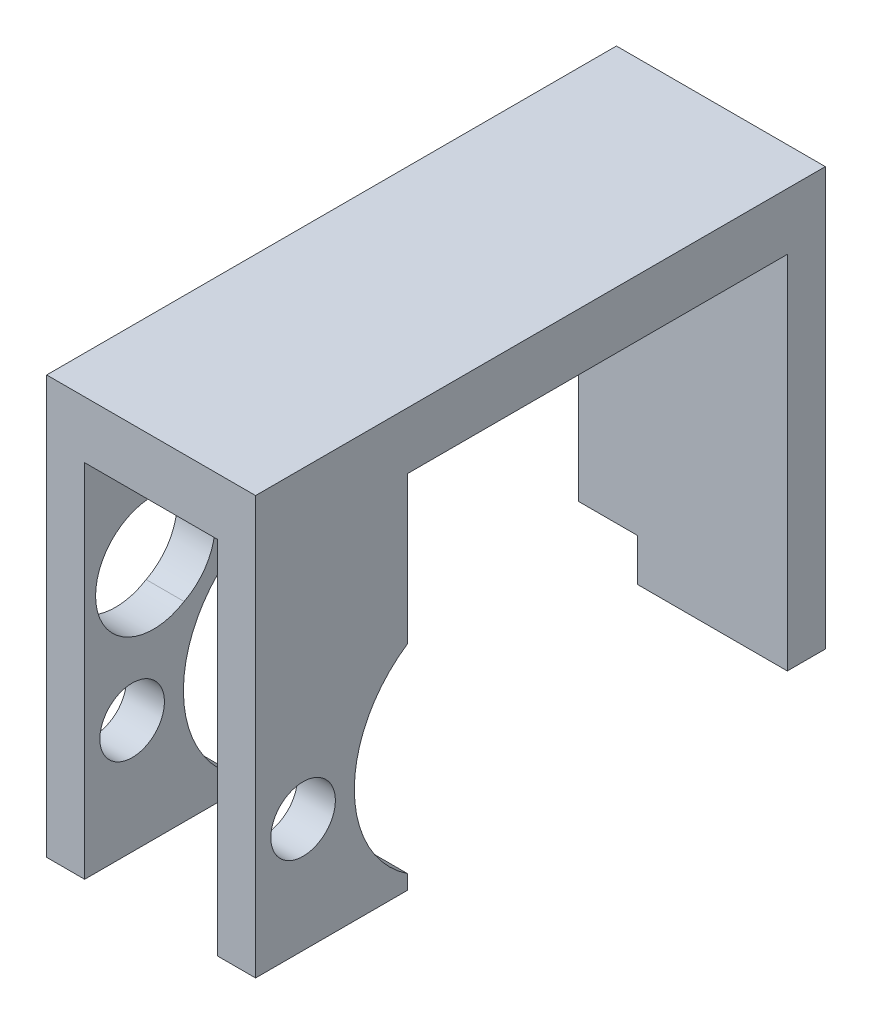
ISO-10303-21;
HEADER;
FILE_DESCRIPTION(('STEP AP214'),'2;1');
FILE_NAME('part.step','',(''),(''),'','','');
FILE_SCHEMA(('AUTOMOTIVE_DESIGN { 1 0 10303 214 1 1 1 1 }'));
ENDSEC;
DATA;
#1=APPLICATION_CONTEXT('core data for automotive mechanical design processes');
#2=APPLICATION_PROTOCOL_DEFINITION('international standard','automotive_design',2000,#1);
#3=PRODUCT_CONTEXT('',#1,'mechanical');
#4=PRODUCT('Part','Part','',(#3));
#5=PRODUCT_RELATED_PRODUCT_CATEGORY('part','',(#4));
#6=PRODUCT_DEFINITION_FORMATION('','',#4);
#7=PRODUCT_DEFINITION_CONTEXT('part definition',#1,'design');
#8=PRODUCT_DEFINITION('design','',#6,#7);
#9=PRODUCT_DEFINITION_SHAPE('','',#8);
#10=(LENGTH_UNIT() NAMED_UNIT(*) SI_UNIT(.MILLI.,.METRE.));
#11=(NAMED_UNIT(*) PLANE_ANGLE_UNIT() SI_UNIT($,.RADIAN.));
#12=(NAMED_UNIT(*) SI_UNIT($,.STERADIAN.) SOLID_ANGLE_UNIT());
#13=UNCERTAINTY_MEASURE_WITH_UNIT(LENGTH_MEASURE(1.E-05),#10,'distance_accuracy_value','');
#14=(GEOMETRIC_REPRESENTATION_CONTEXT(3) GLOBAL_UNCERTAINTY_ASSIGNED_CONTEXT((#13)) GLOBAL_UNIT_ASSIGNED_CONTEXT((#10,
#11,#12)) REPRESENTATION_CONTEXT('',''));
#15=CARTESIAN_POINT('',(0.,0.,0.));
#16=DIRECTION('',(0.,0.,1.));
#17=DIRECTION('',(1.,0.,0.));
#18=AXIS2_PLACEMENT_3D('',#15,#16,#17);
#19=CARTESIAN_POINT('',(-8.9,35.7198777887695,-11.8675));
#20=DIRECTION('',(-1.,0.,0.));
#21=DIRECTION('',(0.,0.,1.));
#22=AXIS2_PLACEMENT_3D('',#19,#20,#21);
#23=CYLINDRICAL_SURFACE('',#22,3.);
#24=CARTESIAN_POINT('',(-10.,35.7198777887695,-11.8675));
#25=DIRECTION('',(1.,0.,0.));
#26=DIRECTION('',(0.,0.,1.));
#27=AXIS2_PLACEMENT_3D('',#24,#25,#26);
#28=CIRCLE('',#27,3.);
#29=CARTESIAN_POINT('',(-10.,38.6800828893261,-11.3804827902028));
#30=VERTEX_POINT('',#29);
#31=CARTESIAN_POINT('',(-10.,33.0507418472652,-13.2370668387377));
#32=VERTEX_POINT('',#31);
#33=EDGE_CURVE('E193',#30,#32,#28,.F.);
#34=ORIENTED_EDGE('',*,*,#33,.F.);
#35=DIRECTION('',(-1.,0.,0.));
#36=VECTOR('',#35,1.);
#37=CARTESIAN_POINT('',(-10.5,38.6800828893261,-11.3804827902028));
#38=LINE('',#37,#36);
#39=CARTESIAN_POINT('',(-12.,38.6800828893261,-11.3804827902028));
#40=VERTEX_POINT('',#39);
#41=EDGE_CURVE('E47',#40,#30,#38,.F.);
#42=ORIENTED_EDGE('',*,*,#41,.F.);
#43=CARTESIAN_POINT('',(-12.,35.7198777887695,-11.8675));
#44=DIRECTION('',(-1.,0.,0.));
#45=DIRECTION('',(0.,0.,-1.));
#46=AXIS2_PLACEMENT_3D('',#43,#44,#45);
#47=CIRCLE('',#46,3.);
#48=CARTESIAN_POINT('',(-12.,33.0507418472652,-13.2370668387377));
#49=VERTEX_POINT('',#48);
#50=EDGE_CURVE('E191',#49,#40,#47,.F.);
#51=ORIENTED_EDGE('',*,*,#50,.F.);
#52=DIRECTION('',(-1.,0.,0.));
#53=VECTOR('',#52,1.);
#54=CARTESIAN_POINT('',(-10.5,33.0507418472652,-13.2370668387377));
#55=LINE('',#54,#53);
#56=EDGE_CURVE('E11',#32,#49,#55,.T.);
#57=ORIENTED_EDGE('',*,*,#56,.F.);
#58=EDGE_LOOP('',(#34,#42,#51,#57));
#59=FACE_BOUND('',#58,.T.);
#60=ADVANCED_FACE('F41',(#59),#23,.F.);
#61=CARTESIAN_POINT('',(0.,0.,-38.));
#62=DIRECTION('',(0.,0.,1.));
#63=DIRECTION('',(1.,0.,0.));
#64=AXIS2_PLACEMENT_3D('',#61,#62,#63);
#65=PLANE('',#64);
#66=DIRECTION('',(-1.,0.,0.));
#67=VECTOR('',#66,1.);
#68=CARTESIAN_POINT('',(-8.9,23.3190905958273,-38.));
#69=LINE('',#68,#67);
#70=CARTESIAN_POINT('',(-8.9,23.3190905958273,-38.));
#71=VERTEX_POINT('',#70);
#72=CARTESIAN_POINT('',(-12.,23.3190905958273,-38.));
#73=VERTEX_POINT('',#72);
#74=EDGE_CURVE('E343',#71,#73,#69,.T.);
#75=ORIENTED_EDGE('',*,*,#74,.T.);
#76=DIRECTION('',(0.,1.,0.));
#77=VECTOR('',#76,1.);
#78=CARTESIAN_POINT('',(-12.,42.,-38.));
#79=LINE('',#78,#77);
#80=CARTESIAN_POINT('',(-12.,45.,-38.));
#81=VERTEX_POINT('',#80);
#82=EDGE_CURVE('E269',#73,#81,#79,.T.);
#83=ORIENTED_EDGE('',*,*,#82,.T.);
#84=DIRECTION('',(1.,0.,0.));
#85=VECTOR('',#84,1.);
#86=CARTESIAN_POINT('',(-12.,45.,-38.));
#87=LINE('',#86,#85);
#88=CARTESIAN_POINT('',(-1.,45.,-38.));
#89=VERTEX_POINT('',#88);
#90=EDGE_CURVE('E267',#81,#89,#87,.T.);
#91=ORIENTED_EDGE('',*,*,#90,.T.);
#92=DIRECTION('',(0.,-1.,0.));
#93=VECTOR('',#92,1.);
#94=CARTESIAN_POINT('',(-1.,45.,-38.));
#95=LINE('',#94,#93);
#96=CARTESIAN_POINT('',(-1.,23.,-38.));
#97=VERTEX_POINT('',#96);
#98=EDGE_CURVE('E265',#89,#97,#95,.T.);
#99=ORIENTED_EDGE('',*,*,#98,.T.);
#100=DIRECTION('',(-1.,0.,0.));
#101=VECTOR('',#100,1.);
#102=CARTESIAN_POINT('',(-1.,23.,-38.));
#103=LINE('',#102,#101);
#104=CARTESIAN_POINT('',(-8.9,23.,-38.));
#105=VERTEX_POINT('',#104);
#106=EDGE_CURVE('E305',#97,#105,#103,.T.);
#107=ORIENTED_EDGE('',*,*,#106,.T.);
#108=DIRECTION('',(0.,-1.,0.));
#109=VECTOR('',#108,1.);
#110=CARTESIAN_POINT('',(-8.9,0.,-38.));
#111=LINE('',#110,#109);
#112=EDGE_CURVE('E192',#71,#105,#111,.T.);
#113=ORIENTED_EDGE('',*,*,#112,.F.);
#114=EDGE_LOOP('',(#75,#83,#91,#99,#107,#113));
#115=FACE_BOUND('',#114,.T.);
#116=ADVANCED_FACE('F359',(#115),#65,.F.);
#117=CARTESIAN_POINT('',(-8.9,22.5,-34.765));
#118=DIRECTION('',(-1.,0.,0.));
#119=DIRECTION('',(0.,0.,1.));
#120=AXIS2_PLACEMENT_3D('',#117,#118,#119);
#121=CYLINDRICAL_SURFACE('',#120,3.);
#122=CARTESIAN_POINT('',(-8.9,22.5,-34.765));
#123=DIRECTION('',(-1.,0.,0.));
#124=DIRECTION('',(0.,0.,-1.));
#125=AXIS2_PLACEMENT_3D('',#122,#123,#124);
#126=CIRCLE('',#125,3.);
#127=CARTESIAN_POINT('',(-8.9,25.23400347476,-36.));
#128=VERTEX_POINT('',#127);
#129=CARTESIAN_POINT('',(-8.9,24.4926321294143,-37.007636215891));
#130=VERTEX_POINT('',#129);
#131=EDGE_CURVE('E336',#128,#130,#126,.T.);
#132=ORIENTED_EDGE('',*,*,#131,.F.);
#133=DIRECTION('',(-1.,0.,0.));
#134=VECTOR('',#133,1.);
#135=CARTESIAN_POINT('',(-8.9,25.23400347476,-36.));
#136=LINE('',#135,#134);
#137=CARTESIAN_POINT('',(-12.,25.23400347476,-36.));
#138=VERTEX_POINT('',#137);
#139=EDGE_CURVE('E201',#128,#138,#136,.T.);
#140=ORIENTED_EDGE('',*,*,#139,.T.);
#141=CARTESIAN_POINT('',(-12.,22.5,-34.765));
#142=DIRECTION('',(-1.,0.,0.));
#143=DIRECTION('',(0.,0.,-1.));
#144=AXIS2_PLACEMENT_3D('',#141,#142,#143);
#145=CIRCLE('',#144,3.);
#146=CARTESIAN_POINT('',(-12.,24.4926321294143,-37.007636215891));
#147=VERTEX_POINT('',#146);
#148=EDGE_CURVE('E333',#147,#138,#145,.F.);
#149=ORIENTED_EDGE('',*,*,#148,.F.);
#150=DIRECTION('',(-1.,0.,0.));
#151=VECTOR('',#150,1.);
#152=CARTESIAN_POINT('',(-10.5,24.4926321294143,-37.007636215891));
#153=LINE('',#152,#151);
#154=EDGE_CURVE('E349',#130,#147,#153,.T.);
#155=ORIENTED_EDGE('',*,*,#154,.F.);
#156=EDGE_LOOP('',(#132,#140,#149,#155));
#157=FACE_BOUND('',#156,.T.);
#158=ADVANCED_FACE('F382',(#157),#121,.F.);
#159=CARTESIAN_POINT('',(0.,0.,-36.));
#160=DIRECTION('',(0.,0.,1.));
#161=DIRECTION('',(1.,0.,0.));
#162=AXIS2_PLACEMENT_3D('',#159,#160,#161);
#163=PLANE('',#162);
#164=DIRECTION('',(0.,-1.,0.));
#165=VECTOR('',#164,1.);
#166=CARTESIAN_POINT('',(-8.9,0.,-36.));
#167=LINE('',#166,#165);
#168=CARTESIAN_POINT('',(-8.9,23.,-36.));
#169=VERTEX_POINT('',#168);
#170=EDGE_CURVE('E331',#128,#169,#167,.T.);
#171=ORIENTED_EDGE('',*,*,#170,.T.);
#172=DIRECTION('',(-1.,0.,0.));
#173=VECTOR('',#172,1.);
#174=CARTESIAN_POINT('',(-1.,23.,-36.));
#175=LINE('',#174,#173);
#176=CARTESIAN_POINT('',(-1.,23.,-36.));
#177=VERTEX_POINT('',#176);
#178=EDGE_CURVE('E301',#177,#169,#175,.T.);
#179=ORIENTED_EDGE('',*,*,#178,.F.);
#180=DIRECTION('',(0.,-1.,0.));
#181=VECTOR('',#180,1.);
#182=CARTESIAN_POINT('',(-1.,45.,-36.));
#183=LINE('',#182,#181);
#184=CARTESIAN_POINT('',(-1.,42.,-36.));
#185=VERTEX_POINT('',#184);
#186=EDGE_CURVE('E307',#185,#177,#183,.T.);
#187=ORIENTED_EDGE('',*,*,#186,.F.);
#188=DIRECTION('',(-1.,0.,0.));
#189=VECTOR('',#188,1.);
#190=CARTESIAN_POINT('',(-1.,42.,-36.));
#191=LINE('',#190,#189);
#192=CARTESIAN_POINT('',(-12.,42.,-36.));
#193=VERTEX_POINT('',#192);
#194=EDGE_CURVE('E298',#185,#193,#191,.T.);
#195=ORIENTED_EDGE('',*,*,#194,.T.);
#196=DIRECTION('',(0.,1.,0.));
#197=VECTOR('',#196,1.);
#198=CARTESIAN_POINT('',(-12.,23.,-36.));
#199=LINE('',#198,#197);
#200=EDGE_CURVE('E304',#138,#193,#199,.T.);
#201=ORIENTED_EDGE('',*,*,#200,.F.);
#202=ORIENTED_EDGE('',*,*,#139,.F.);
#203=EDGE_LOOP('',(#171,#179,#187,#195,#201,#202));
#204=FACE_BOUND('',#203,.T.);
#205=ADVANCED_FACE('F378',(#204),#163,.T.);
#206=CARTESIAN_POINT('',(-1.,23.,-36.));
#207=DIRECTION('',(0.,1.,0.));
#208=DIRECTION('',(0.,0.,-1.));
#209=AXIS2_PLACEMENT_3D('',#206,#207,#208);
#210=PLANE('',#209);
#211=ORIENTED_EDGE('',*,*,#106,.F.);
#212=DIRECTION('',(0.,0.,-1.));
#213=VECTOR('',#212,1.);
#214=CARTESIAN_POINT('',(-1.,23.,-36.));
#215=LINE('',#214,#213);
#216=EDGE_CURVE('E299',#177,#97,#215,.T.);
#217=ORIENTED_EDGE('',*,*,#216,.F.);
#218=ORIENTED_EDGE('',*,*,#178,.T.);
#219=DIRECTION('',(0.,0.,1.));
#220=VECTOR('',#219,1.);
#221=CARTESIAN_POINT('',(-8.9,23.,-36.));
#222=LINE('',#221,#220);
#223=EDGE_CURVE('E200',#105,#169,#222,.T.);
#224=ORIENTED_EDGE('',*,*,#223,.F.);
#225=EDGE_LOOP('',(#211,#217,#218,#224));
#226=FACE_BOUND('',#225,.T.);
#227=ADVANCED_FACE('F376',(#226),#210,.F.);
#228=CARTESIAN_POINT('',(0.,0.,-16.));
#229=DIRECTION('',(0.,0.,1.));
#230=DIRECTION('',(1.,0.,0.));
#231=AXIS2_PLACEMENT_3D('',#228,#229,#230);
#232=PLANE('',#231);
#233=DIRECTION('',(-1.,0.,0.));
#234=VECTOR('',#233,1.);
#235=CARTESIAN_POINT('',(-0.799999999999999,23.7616796585165,-16.));
#236=LINE('',#235,#234);
#237=CARTESIAN_POINT('',(-12.,23.7616796585165,-16.));
#238=VERTEX_POINT('',#237);
#239=CARTESIAN_POINT('',(-10.,23.7616796585165,-16.));
#240=VERTEX_POINT('',#239);
#241=EDGE_CURVE('E314',#238,#240,#236,.F.);
#242=ORIENTED_EDGE('',*,*,#241,.T.);
#243=DIRECTION('',(0.,-1.,0.));
#244=VECTOR('',#243,1.);
#245=CARTESIAN_POINT('',(-10.,45.,-16.));
#246=LINE('',#245,#244);
#247=CARTESIAN_POINT('',(-10.,23.,-16.));
#248=VERTEX_POINT('',#247);
#249=EDGE_CURVE('E238',#240,#248,#246,.T.);
#250=ORIENTED_EDGE('',*,*,#249,.T.);
#251=DIRECTION('',(-1.,0.,0.));
#252=VECTOR('',#251,1.);
#253=CARTESIAN_POINT('',(-10.,23.,-16.));
#254=LINE('',#253,#252);
#255=CARTESIAN_POINT('',(-12.,23.,-16.));
#256=VERTEX_POINT('',#255);
#257=EDGE_CURVE('E233',#248,#256,#254,.T.);
#258=ORIENTED_EDGE('',*,*,#257,.T.);
#259=DIRECTION('',(0.,1.,0.));
#260=VECTOR('',#259,1.);
#261=CARTESIAN_POINT('',(-12.,23.,-16.));
#262=LINE('',#261,#260);
#263=EDGE_CURVE('E237',#256,#238,#262,.T.);
#264=ORIENTED_EDGE('',*,*,#263,.T.);
#265=EDGE_LOOP('',(#242,#250,#258,#264));
#266=FACE_BOUND('',#265,.T.);
#267=ADVANCED_FACE('F398',(#266),#232,.F.);
#268=DIRECTION('',(-1.,0.,0.));
#269=VECTOR('',#268,1.);
#270=CARTESIAN_POINT('',(-0.799999999999999,34.2383203414835,-16.));
#271=LINE('',#270,#269);
#272=CARTESIAN_POINT('',(-10.,34.2383203414835,-16.));
#273=VERTEX_POINT('',#272);
#274=CARTESIAN_POINT('',(-12.,34.2383203414835,-16.));
#275=VERTEX_POINT('',#274);
#276=EDGE_CURVE('E319',#273,#275,#271,.T.);
#277=ORIENTED_EDGE('',*,*,#276,.T.);
#278=CARTESIAN_POINT('',(-12.,42.,-16.));
#279=VERTEX_POINT('',#278);
#280=EDGE_CURVE('E245',#275,#279,#262,.T.);
#281=ORIENTED_EDGE('',*,*,#280,.T.);
#282=DIRECTION('',(1.,0.,0.));
#283=VECTOR('',#282,1.);
#284=CARTESIAN_POINT('',(0.,42.,-16.));
#285=LINE('',#284,#283);
#286=CARTESIAN_POINT('',(-10.,42.,-16.));
#287=VERTEX_POINT('',#286);
#288=EDGE_CURVE('E222',#279,#287,#285,.T.);
#289=ORIENTED_EDGE('',*,*,#288,.T.);
#290=EDGE_CURVE('E232',#287,#273,#246,.T.);
#291=ORIENTED_EDGE('',*,*,#290,.T.);
#292=EDGE_LOOP('',(#277,#281,#289,#291));
#293=FACE_BOUND('',#292,.T.);
#294=ADVANCED_FACE('F392',(#293),#232,.F.);
#295=CARTESIAN_POINT('',(0.,0.,-16.));
#296=DIRECTION('',(0.,0.,1.));
#297=DIRECTION('',(1.,0.,0.));
#298=AXIS2_PLACEMENT_3D('',#295,#296,#297);
#299=PLANE('',#298);
#300=DIRECTION('',(-1.,0.,0.));
#301=VECTOR('',#300,1.);
#302=CARTESIAN_POINT('',(-0.799999999999999,23.7616796585165,-16.));
#303=LINE('',#302,#301);
#304=CARTESIAN_POINT('',(-3.,23.7616796585165,-16.));
#305=VERTEX_POINT('',#304);
#306=CARTESIAN_POINT('',(-1.,23.7616796585165,-16.));
#307=VERTEX_POINT('',#306);
#308=EDGE_CURVE('E199',#305,#307,#303,.F.);
#309=ORIENTED_EDGE('',*,*,#308,.T.);
#310=DIRECTION('',(0.,-1.,0.));
#311=VECTOR('',#310,1.);
#312=CARTESIAN_POINT('',(-1.,45.,-16.));
#313=LINE('',#312,#311);
#314=CARTESIAN_POINT('',(-1.,23.,-16.));
#315=VERTEX_POINT('',#314);
#316=EDGE_CURVE('E288',#307,#315,#313,.T.);
#317=ORIENTED_EDGE('',*,*,#316,.T.);
#318=DIRECTION('',(-1.,0.,0.));
#319=VECTOR('',#318,1.);
#320=CARTESIAN_POINT('',(-1.,23.,-16.));
#321=LINE('',#320,#319);
#322=CARTESIAN_POINT('',(-3.,23.,-16.));
#323=VERTEX_POINT('',#322);
#324=EDGE_CURVE('E282',#315,#323,#321,.T.);
#325=ORIENTED_EDGE('',*,*,#324,.T.);
#326=DIRECTION('',(0.,1.,0.));
#327=VECTOR('',#326,1.);
#328=CARTESIAN_POINT('',(-3.,23.,-16.));
#329=LINE('',#328,#327);
#330=EDGE_CURVE('E289',#323,#305,#329,.T.);
#331=ORIENTED_EDGE('',*,*,#330,.T.);
#332=EDGE_LOOP('',(#309,#317,#325,#331));
#333=FACE_BOUND('',#332,.T.);
#334=ADVANCED_FACE('F416',(#333),#299,.F.);
#335=DIRECTION('',(-1.,0.,0.));
#336=VECTOR('',#335,1.);
#337=CARTESIAN_POINT('',(-0.799999999999999,34.2383203414835,-16.));
#338=LINE('',#337,#336);
#339=CARTESIAN_POINT('',(-1.,34.2383203414835,-16.));
#340=VERTEX_POINT('',#339);
#341=CARTESIAN_POINT('',(-3.,34.2383203414835,-16.));
#342=VERTEX_POINT('',#341);
#343=EDGE_CURVE('E211',#340,#342,#338,.T.);
#344=ORIENTED_EDGE('',*,*,#343,.T.);
#345=CARTESIAN_POINT('',(-3.,42.,-16.));
#346=VERTEX_POINT('',#345);
#347=EDGE_CURVE('E292',#342,#346,#329,.T.);
#348=ORIENTED_EDGE('',*,*,#347,.T.);
#349=DIRECTION('',(-1.,0.,0.));
#350=VECTOR('',#349,1.);
#351=CARTESIAN_POINT('',(-1.,42.,-16.));
#352=LINE('',#351,#350);
#353=CARTESIAN_POINT('',(-1.,42.,-16.));
#354=VERTEX_POINT('',#353);
#355=EDGE_CURVE('E219',#354,#346,#352,.T.);
#356=ORIENTED_EDGE('',*,*,#355,.F.);
#357=EDGE_CURVE('E283',#354,#340,#313,.T.);
#358=ORIENTED_EDGE('',*,*,#357,.T.);
#359=EDGE_LOOP('',(#344,#348,#356,#358));
#360=FACE_BOUND('',#359,.T.);
#361=ADVANCED_FACE('F426',(#360),#299,.F.);
#362=CARTESIAN_POINT('',(-1.,42.,-8.));
#363=DIRECTION('',(0.,1.,0.));
#364=DIRECTION('',(0.,0.,-1.));
#365=AXIS2_PLACEMENT_3D('',#362,#363,#364);
#366=PLANE('',#365);
#367=DIRECTION('',(0.,0.,-1.));
#368=VECTOR('',#367,1.);
#369=CARTESIAN_POINT('',(-1.,42.,-8.));
#370=LINE('',#369,#368);
#371=EDGE_CURVE('E256',#354,#185,#370,.T.);
#372=ORIENTED_EDGE('',*,*,#371,.F.);
#373=ORIENTED_EDGE('',*,*,#355,.T.);
#374=DIRECTION('',(0.,0.,1.));
#375=VECTOR('',#374,1.);
#376=CARTESIAN_POINT('',(-3.,42.,-8.));
#377=LINE('',#376,#375);
#378=CARTESIAN_POINT('',(-3.,42.,-8.));
#379=VERTEX_POINT('',#378);
#380=EDGE_CURVE('E212',#346,#379,#377,.T.);
#381=ORIENTED_EDGE('',*,*,#380,.T.);
#382=DIRECTION('',(-1.,0.,0.));
#383=VECTOR('',#382,1.);
#384=CARTESIAN_POINT('',(-1.,42.,-8.));
#385=LINE('',#384,#383);
#386=CARTESIAN_POINT('',(-10.,42.,-8.));
#387=VERTEX_POINT('',#386);
#388=EDGE_CURVE('E262',#379,#387,#385,.T.);
#389=ORIENTED_EDGE('',*,*,#388,.T.);
#390=DIRECTION('',(0.,0.,1.));
#391=VECTOR('',#390,1.);
#392=CARTESIAN_POINT('',(-10.,42.,-8.));
#393=LINE('',#392,#391);
#394=EDGE_CURVE('E255',#287,#387,#393,.T.);
#395=ORIENTED_EDGE('',*,*,#394,.F.);
#396=ORIENTED_EDGE('',*,*,#288,.F.);
#397=DIRECTION('',(0.,0.,-1.));
#398=VECTOR('',#397,1.);
#399=CARTESIAN_POINT('',(-12.,42.,-8.));
#400=LINE('',#399,#398);
#401=EDGE_CURVE('E258',#279,#193,#400,.T.);
#402=ORIENTED_EDGE('',*,*,#401,.T.);
#403=ORIENTED_EDGE('',*,*,#194,.F.);
#404=EDGE_LOOP('',(#372,#373,#381,#389,#395,#396,#402,#403));
#405=FACE_BOUND('',#404,.T.);
#406=ADVANCED_FACE('F389',(#405),#366,.F.);
#407=CARTESIAN_POINT('',(-10.,45.,-8.));
#408=DIRECTION('',(-1.,0.,0.));
#409=DIRECTION('',(0.,0.,1.));
#410=AXIS2_PLACEMENT_3D('',#407,#408,#409);
#411=PLANE('',#410);
#412=CARTESIAN_POINT('',(-10.,35.6399001096049,-11.625));
#413=DIRECTION('',(1.,0.,0.));
#414=DIRECTION('',(0.,0.,1.));
#415=AXIS2_PLACEMENT_3D('',#412,#413,#414);
#416=CIRCLE('',#415,3.05);
#417=EDGE_CURVE('E54',#32,#30,#416,.F.);
#418=ORIENTED_EDGE('',*,*,#417,.T.);
#419=ORIENTED_EDGE('',*,*,#33,.T.);
#420=EDGE_LOOP('',(#418,#419));
#421=FACE_BOUND('',#420,.T.);
#422=CARTESIAN_POINT('',(-10.,29.,-10.5));
#423=DIRECTION('',(1.,0.,0.));
#424=DIRECTION('',(0.,0.,1.));
#425=AXIS2_PLACEMENT_3D('',#422,#423,#424);
#426=CIRCLE('',#425,1.7);
#427=CARTESIAN_POINT('',(-10.,29.,-8.8));
#428=VERTEX_POINT('',#427);
#429=EDGE_CURVE('E209',#428,#428,#426,.F.);
#430=ORIENTED_EDGE('',*,*,#429,.T.);
#431=EDGE_LOOP('',(#430));
#432=FACE_BOUND('',#431,.T.);
#433=CARTESIAN_POINT('',(-10.,29.,-19.5));
#434=DIRECTION('',(1.,0.,0.));
#435=DIRECTION('',(0.,0.,1.));
#436=AXIS2_PLACEMENT_3D('',#433,#434,#435);
#437=CIRCLE('',#436,6.3);
#438=EDGE_CURVE('E306',#240,#273,#437,.F.);
#439=ORIENTED_EDGE('',*,*,#438,.T.);
#440=ORIENTED_EDGE('',*,*,#290,.F.);
#441=ORIENTED_EDGE('',*,*,#394,.T.);
#442=DIRECTION('',(0.,-1.,0.));
#443=VECTOR('',#442,1.);
#444=CARTESIAN_POINT('',(-10.,45.,-8.));
#445=LINE('',#444,#443);
#446=CARTESIAN_POINT('',(-10.,23.,-8.));
#447=VERTEX_POINT('',#446);
#448=EDGE_CURVE('E242',#387,#447,#445,.T.);
#449=ORIENTED_EDGE('',*,*,#448,.T.);
#450=DIRECTION('',(0.,0.,-1.));
#451=VECTOR('',#450,1.);
#452=CARTESIAN_POINT('',(-10.,23.,-8.));
#453=LINE('',#452,#451);
#454=EDGE_CURVE('E228',#447,#248,#453,.T.);
#455=ORIENTED_EDGE('',*,*,#454,.T.);
#456=ORIENTED_EDGE('',*,*,#249,.F.);
#457=EDGE_LOOP('',(#439,#440,#441,#449,#455,#456));
#458=FACE_BOUND('',#457,.T.);
#459=ADVANCED_FACE('F404',(#421,#432,#458),#411,.F.);
#460=CARTESIAN_POINT('',(-12.,23.,-8.));
#461=DIRECTION('',(1.,0.,0.));
#462=DIRECTION('',(0.,0.,-1.));
#463=AXIS2_PLACEMENT_3D('',#460,#461,#462);
#464=PLANE('',#463);
#465=CARTESIAN_POINT('',(-12.,35.6399001096049,-11.625));
#466=DIRECTION('',(-1.,0.,0.));
#467=DIRECTION('',(0.,0.,-1.));
#468=AXIS2_PLACEMENT_3D('',#465,#466,#467);
#469=CIRCLE('',#468,3.05);
#470=EDGE_CURVE('E182',#40,#49,#469,.F.);
#471=ORIENTED_EDGE('',*,*,#470,.T.);
#472=ORIENTED_EDGE('',*,*,#50,.T.);
#473=EDGE_LOOP('',(#471,#472));
#474=FACE_BOUND('',#473,.T.);
#475=CARTESIAN_POINT('',(-12.,22.,-35.25));
#476=DIRECTION('',(-1.,0.,0.));
#477=DIRECTION('',(0.,0.,-1.));
#478=AXIS2_PLACEMENT_3D('',#475,#476,#477);
#479=CIRCLE('',#478,3.05);
#480=EDGE_CURVE('E65',#73,#147,#479,.F.);
#481=ORIENTED_EDGE('',*,*,#480,.T.);
#482=ORIENTED_EDGE('',*,*,#148,.T.);
#483=ORIENTED_EDGE('',*,*,#200,.T.);
#484=ORIENTED_EDGE('',*,*,#401,.F.);
#485=ORIENTED_EDGE('',*,*,#280,.F.);
#486=CARTESIAN_POINT('',(-12.,29.,-19.5));
#487=DIRECTION('',(-1.,0.,0.));
#488=DIRECTION('',(0.,0.,-1.));
#489=AXIS2_PLACEMENT_3D('',#486,#487,#488);
#490=CIRCLE('',#489,6.3);
#491=EDGE_CURVE('E324',#275,#238,#490,.F.);
#492=ORIENTED_EDGE('',*,*,#491,.T.);
#493=ORIENTED_EDGE('',*,*,#263,.F.);
#494=DIRECTION('',(0.,0.,-1.));
#495=VECTOR('',#494,1.);
#496=CARTESIAN_POINT('',(-12.,23.,-8.));
#497=LINE('',#496,#495);
#498=CARTESIAN_POINT('',(-12.,23.,-8.));
#499=VERTEX_POINT('',#498);
#500=EDGE_CURVE('E226',#499,#256,#497,.T.);
#501=ORIENTED_EDGE('',*,*,#500,.F.);
#502=DIRECTION('',(0.,1.,0.));
#503=VECTOR('',#502,1.);
#504=CARTESIAN_POINT('',(-12.,23.,-8.));
#505=LINE('',#504,#503);
#506=CARTESIAN_POINT('',(-12.,45.,-8.));
#507=VERTEX_POINT('',#506);
#508=EDGE_CURVE('E234',#499,#507,#505,.T.);
#509=ORIENTED_EDGE('',*,*,#508,.T.);
#510=DIRECTION('',(0.,0.,-1.));
#511=VECTOR('',#510,1.);
#512=CARTESIAN_POINT('',(-12.,45.,-8.));
#513=LINE('',#512,#511);
#514=EDGE_CURVE('E224',#507,#81,#513,.T.);
#515=ORIENTED_EDGE('',*,*,#514,.T.);
#516=ORIENTED_EDGE('',*,*,#82,.F.);
#517=EDGE_LOOP('',(#481,#482,#483,#484,#485,#492,#493,#501,#509,#515,#516));
#518=FACE_BOUND('',#517,.T.);
#519=CARTESIAN_POINT('',(-12.,29.,-10.5));
#520=DIRECTION('',(-1.,0.,0.));
#521=DIRECTION('',(0.,0.,-1.));
#522=AXIS2_PLACEMENT_3D('',#519,#520,#521);
#523=CIRCLE('',#522,1.7);
#524=CARTESIAN_POINT('',(-12.,29.,-12.2));
#525=VERTEX_POINT('',#524);
#526=EDGE_CURVE('E207',#525,#525,#523,.F.);
#527=ORIENTED_EDGE('',*,*,#526,.T.);
#528=EDGE_LOOP('',(#527));
#529=FACE_BOUND('',#528,.T.);
#530=ADVANCED_FACE('F43',(#474,#518,#529),#464,.F.);
#531=CARTESIAN_POINT('',(-12.,45.,-8.));
#532=DIRECTION('',(0.,-1.,0.));
#533=DIRECTION('',(0.,0.,1.));
#534=AXIS2_PLACEMENT_3D('',#531,#532,#533);
#535=PLANE('',#534);
#536=ORIENTED_EDGE('',*,*,#514,.F.);
#537=DIRECTION('',(1.,0.,0.));
#538=VECTOR('',#537,1.);
#539=CARTESIAN_POINT('',(-12.,45.,-8.));
#540=LINE('',#539,#538);
#541=CARTESIAN_POINT('',(-1.,45.,-8.));
#542=VERTEX_POINT('',#541);
#543=EDGE_CURVE('E250',#507,#542,#540,.T.);
#544=ORIENTED_EDGE('',*,*,#543,.T.);
#545=DIRECTION('',(0.,0.,-1.));
#546=VECTOR('',#545,1.);
#547=CARTESIAN_POINT('',(-1.,45.,-8.));
#548=LINE('',#547,#546);
#549=EDGE_CURVE('E253',#542,#89,#548,.T.);
#550=ORIENTED_EDGE('',*,*,#549,.T.);
#551=ORIENTED_EDGE('',*,*,#90,.F.);
#552=EDGE_LOOP('',(#536,#544,#550,#551));
#553=FACE_BOUND('',#552,.T.);
#554=ADVANCED_FACE('F367',(#553),#535,.F.);
#555=CARTESIAN_POINT('',(-10.,23.,-8.));
#556=DIRECTION('',(0.,1.,0.));
#557=DIRECTION('',(0.,0.,-1.));
#558=AXIS2_PLACEMENT_3D('',#555,#556,#557);
#559=PLANE('',#558);
#560=ORIENTED_EDGE('',*,*,#257,.F.);
#561=ORIENTED_EDGE('',*,*,#454,.F.);
#562=DIRECTION('',(-1.,0.,0.));
#563=VECTOR('',#562,1.);
#564=CARTESIAN_POINT('',(-10.,23.,-8.));
#565=LINE('',#564,#563);
#566=EDGE_CURVE('E229',#447,#499,#565,.T.);
#567=ORIENTED_EDGE('',*,*,#566,.T.);
#568=ORIENTED_EDGE('',*,*,#500,.T.);
#569=EDGE_LOOP('',(#560,#561,#567,#568));
#570=FACE_BOUND('',#569,.T.);
#571=ADVANCED_FACE('F406',(#570),#559,.F.);
#572=CARTESIAN_POINT('',(0.,0.,-8.));
#573=DIRECTION('',(0.,0.,1.));
#574=DIRECTION('',(1.,0.,0.));
#575=AXIS2_PLACEMENT_3D('',#572,#573,#574);
#576=PLANE('',#575);
#577=ORIENTED_EDGE('',*,*,#543,.F.);
#578=ORIENTED_EDGE('',*,*,#508,.F.);
#579=ORIENTED_EDGE('',*,*,#566,.F.);
#580=ORIENTED_EDGE('',*,*,#448,.F.);
#581=ORIENTED_EDGE('',*,*,#388,.F.);
#582=DIRECTION('',(0.,1.,0.));
#583=VECTOR('',#582,1.);
#584=CARTESIAN_POINT('',(-3.,23.,-8.));
#585=LINE('',#584,#583);
#586=CARTESIAN_POINT('',(-3.,23.,-8.));
#587=VERTEX_POINT('',#586);
#588=EDGE_CURVE('E281',#587,#379,#585,.T.);
#589=ORIENTED_EDGE('',*,*,#588,.F.);
#590=DIRECTION('',(-1.,0.,0.));
#591=VECTOR('',#590,1.);
#592=CARTESIAN_POINT('',(-1.,23.,-8.));
#593=LINE('',#592,#591);
#594=CARTESIAN_POINT('',(-1.,23.,-8.));
#595=VERTEX_POINT('',#594);
#596=EDGE_CURVE('E277',#595,#587,#593,.T.);
#597=ORIENTED_EDGE('',*,*,#596,.F.);
#598=DIRECTION('',(0.,-1.,0.));
#599=VECTOR('',#598,1.);
#600=CARTESIAN_POINT('',(-1.,45.,-8.));
#601=LINE('',#600,#599);
#602=EDGE_CURVE('E263',#542,#595,#601,.T.);
#603=ORIENTED_EDGE('',*,*,#602,.F.);
#604=EDGE_LOOP('',(#577,#578,#579,#580,#581,#589,#597,#603));
#605=FACE_BOUND('',#604,.T.);
#606=ADVANCED_FACE('F407',(#605),#576,.T.);
#607=CARTESIAN_POINT('',(-1.,45.,-8.));
#608=DIRECTION('',(-1.,0.,0.));
#609=DIRECTION('',(0.,0.,1.));
#610=AXIS2_PLACEMENT_3D('',#607,#608,#609);
#611=PLANE('',#610);
#612=CARTESIAN_POINT('',(-1.,29.,-10.5));
#613=DIRECTION('',(1.,0.,0.));
#614=DIRECTION('',(0.,0.,1.));
#615=AXIS2_PLACEMENT_3D('',#612,#613,#614);
#616=CIRCLE('',#615,1.7);
#617=CARTESIAN_POINT('',(-1.,29.,-8.8));
#618=VERTEX_POINT('',#617);
#619=EDGE_CURVE('E204',#618,#618,#616,.F.);
#620=ORIENTED_EDGE('',*,*,#619,.T.);
#621=EDGE_LOOP('',(#620));
#622=FACE_BOUND('',#621,.T.);
#623=CARTESIAN_POINT('',(-1.,29.,-19.5));
#624=DIRECTION('',(1.,0.,0.));
#625=DIRECTION('',(0.,0.,1.));
#626=AXIS2_PLACEMENT_3D('',#623,#624,#625);
#627=CIRCLE('',#626,6.3);
#628=EDGE_CURVE('E325',#307,#340,#627,.F.);
#629=ORIENTED_EDGE('',*,*,#628,.T.);
#630=ORIENTED_EDGE('',*,*,#357,.F.);
#631=ORIENTED_EDGE('',*,*,#371,.T.);
#632=ORIENTED_EDGE('',*,*,#186,.T.);
#633=ORIENTED_EDGE('',*,*,#216,.T.);
#634=ORIENTED_EDGE('',*,*,#98,.F.);
#635=ORIENTED_EDGE('',*,*,#549,.F.);
#636=ORIENTED_EDGE('',*,*,#602,.T.);
#637=DIRECTION('',(0.,0.,-1.));
#638=VECTOR('',#637,1.);
#639=CARTESIAN_POINT('',(-1.,23.,-8.));
#640=LINE('',#639,#638);
#641=EDGE_CURVE('E275',#595,#315,#640,.T.);
#642=ORIENTED_EDGE('',*,*,#641,.T.);
#643=ORIENTED_EDGE('',*,*,#316,.F.);
#644=EDGE_LOOP('',(#629,#630,#631,#632,#633,#634,#635,#636,#642,#643));
#645=FACE_BOUND('',#644,.T.);
#646=ADVANCED_FACE('F375',(#622,#645),#611,.F.);
#647=CARTESIAN_POINT('',(-3.,23.,-8.));
#648=DIRECTION('',(1.,0.,0.));
#649=DIRECTION('',(0.,0.,-1.));
#650=AXIS2_PLACEMENT_3D('',#647,#648,#649);
#651=PLANE('',#650);
#652=CARTESIAN_POINT('',(-3.,29.,-10.5));
#653=DIRECTION('',(-1.,0.,0.));
#654=DIRECTION('',(0.,0.,-1.));
#655=AXIS2_PLACEMENT_3D('',#652,#653,#654);
#656=CIRCLE('',#655,1.7);
#657=CARTESIAN_POINT('',(-3.,29.,-12.2));
#658=VERTEX_POINT('',#657);
#659=EDGE_CURVE('E202',#658,#658,#656,.F.);
#660=ORIENTED_EDGE('',*,*,#659,.T.);
#661=EDGE_LOOP('',(#660));
#662=FACE_BOUND('',#661,.T.);
#663=CARTESIAN_POINT('',(-3.,29.,-19.5));
#664=DIRECTION('',(-1.,0.,0.));
#665=DIRECTION('',(0.,0.,-1.));
#666=AXIS2_PLACEMENT_3D('',#663,#664,#665);
#667=CIRCLE('',#666,6.3);
#668=EDGE_CURVE('E322',#342,#305,#667,.F.);
#669=ORIENTED_EDGE('',*,*,#668,.T.);
#670=ORIENTED_EDGE('',*,*,#330,.F.);
#671=DIRECTION('',(0.,0.,-1.));
#672=VECTOR('',#671,1.);
#673=CARTESIAN_POINT('',(-3.,23.,-8.));
#674=LINE('',#673,#672);
#675=EDGE_CURVE('E280',#587,#323,#674,.T.);
#676=ORIENTED_EDGE('',*,*,#675,.F.);
#677=ORIENTED_EDGE('',*,*,#588,.T.);
#678=ORIENTED_EDGE('',*,*,#380,.F.);
#679=ORIENTED_EDGE('',*,*,#347,.F.);
#680=EDGE_LOOP('',(#669,#670,#676,#677,#678,#679));
#681=FACE_BOUND('',#680,.T.);
#682=ADVANCED_FACE('F435',(#662,#681),#651,.F.);
#683=CARTESIAN_POINT('',(-1.,23.,-8.));
#684=DIRECTION('',(0.,1.,0.));
#685=DIRECTION('',(0.,0.,-1.));
#686=AXIS2_PLACEMENT_3D('',#683,#684,#685);
#687=PLANE('',#686);
#688=ORIENTED_EDGE('',*,*,#324,.F.);
#689=ORIENTED_EDGE('',*,*,#641,.F.);
#690=ORIENTED_EDGE('',*,*,#596,.T.);
#691=ORIENTED_EDGE('',*,*,#675,.T.);
#692=EDGE_LOOP('',(#688,#689,#690,#691));
#693=FACE_BOUND('',#692,.T.);
#694=ADVANCED_FACE('F420',(#693),#687,.F.);
#695=CARTESIAN_POINT('',(-0.799999999999999,29.,-19.5));
#696=DIRECTION('',(-1.,0.,0.));
#697=DIRECTION('',(0.,0.,1.));
#698=AXIS2_PLACEMENT_3D('',#695,#696,#697);
#699=CYLINDRICAL_SURFACE('',#698,6.3);
#700=ORIENTED_EDGE('',*,*,#308,.F.);
#701=ORIENTED_EDGE('',*,*,#668,.F.);
#702=ORIENTED_EDGE('',*,*,#343,.F.);
#703=ORIENTED_EDGE('',*,*,#628,.F.);
#704=EDGE_LOOP('',(#700,#701,#702,#703));
#705=FACE_BOUND('',#704,.T.);
#706=ADVANCED_FACE('F421',(#705),#699,.F.);
#707=ORIENTED_EDGE('',*,*,#438,.F.);
#708=ORIENTED_EDGE('',*,*,#241,.F.);
#709=ORIENTED_EDGE('',*,*,#491,.F.);
#710=ORIENTED_EDGE('',*,*,#276,.F.);
#711=EDGE_LOOP('',(#707,#708,#709,#710));
#712=FACE_BOUND('',#711,.T.);
#713=ADVANCED_FACE('F402',(#712),#699,.F.);
#714=CARTESIAN_POINT('',(-9.8,29.,-10.5));
#715=DIRECTION('',(-1.,0.,0.));
#716=DIRECTION('',(0.,0.,1.));
#717=AXIS2_PLACEMENT_3D('',#714,#715,#716);
#718=CYLINDRICAL_SURFACE('',#717,1.7);
#719=ORIENTED_EDGE('',*,*,#526,.F.);
#720=EDGE_LOOP('',(#719));
#721=FACE_BOUND('',#720,.T.);
#722=ORIENTED_EDGE('',*,*,#429,.F.);
#723=EDGE_LOOP('',(#722));
#724=FACE_BOUND('',#723,.T.);
#725=ADVANCED_FACE('F456',(#721,#724),#718,.F.);
#726=CARTESIAN_POINT('',(-0.8,29.,-10.5));
#727=DIRECTION('',(-1.,0.,0.));
#728=DIRECTION('',(0.,0.,1.));
#729=AXIS2_PLACEMENT_3D('',#726,#727,#728);
#730=CYLINDRICAL_SURFACE('',#729,1.7);
#731=ORIENTED_EDGE('',*,*,#659,.F.);
#732=EDGE_LOOP('',(#731));
#733=FACE_BOUND('',#732,.T.);
#734=ORIENTED_EDGE('',*,*,#619,.F.);
#735=EDGE_LOOP('',(#734));
#736=FACE_BOUND('',#735,.T.);
#737=ADVANCED_FACE('F453',(#733,#736),#730,.F.);
#738=CARTESIAN_POINT('',(-8.9,22.5,-34.765));
#739=DIRECTION('',(1.,0.,0.));
#740=DIRECTION('',(0.,0.,-1.));
#741=AXIS2_PLACEMENT_3D('',#738,#739,#740);
#742=PLANE('',#741);
#743=ORIENTED_EDGE('',*,*,#223,.T.);
#744=ORIENTED_EDGE('',*,*,#170,.F.);
#745=ORIENTED_EDGE('',*,*,#131,.T.);
#746=CARTESIAN_POINT('',(-8.9,22.,-35.25));
#747=DIRECTION('',(-1.,0.,0.));
#748=DIRECTION('',(0.,0.,-1.));
#749=AXIS2_PLACEMENT_3D('',#746,#747,#748);
#750=CIRCLE('',#749,3.05);
#751=EDGE_CURVE('E348',#130,#71,#750,.T.);
#752=ORIENTED_EDGE('',*,*,#751,.T.);
#753=ORIENTED_EDGE('',*,*,#112,.T.);
#754=EDGE_LOOP('',(#743,#744,#745,#752,#753));
#755=FACE_BOUND('',#754,.T.);
#756=ADVANCED_FACE('F354',(#755),#742,.F.);
#757=CARTESIAN_POINT('',(-8.9,22.,-35.25));
#758=DIRECTION('',(-1.,0.,0.));
#759=DIRECTION('',(0.,0.,1.));
#760=AXIS2_PLACEMENT_3D('',#757,#758,#759);
#761=CYLINDRICAL_SURFACE('',#760,3.05);
#762=ORIENTED_EDGE('',*,*,#74,.F.);
#763=ORIENTED_EDGE('',*,*,#751,.F.);
#764=ORIENTED_EDGE('',*,*,#154,.T.);
#765=ORIENTED_EDGE('',*,*,#480,.F.);
#766=EDGE_LOOP('',(#762,#763,#764,#765));
#767=FACE_BOUND('',#766,.T.);
#768=ADVANCED_FACE('F365',(#767),#761,.F.);
#769=CARTESIAN_POINT('',(-8.9,35.6399001096049,-11.625));
#770=DIRECTION('',(-1.,0.,0.));
#771=DIRECTION('',(0.,0.,1.));
#772=AXIS2_PLACEMENT_3D('',#769,#770,#771);
#773=CYLINDRICAL_SURFACE('',#772,3.05);
#774=ORIENTED_EDGE('',*,*,#417,.F.);
#775=ORIENTED_EDGE('',*,*,#56,.T.);
#776=ORIENTED_EDGE('',*,*,#470,.F.);
#777=ORIENTED_EDGE('',*,*,#41,.T.);
#778=EDGE_LOOP('',(#774,#775,#776,#777));
#779=FACE_BOUND('',#778,.T.);
#780=ADVANCED_FACE('F184',(#779),#773,.F.);
#781=CLOSED_SHELL('',(#60,#116,#158,#205,#227,#267,#294,#334,#361,#406,#459,#530,#554,#571,#606,
#646,#682,#694,#706,#713,#725,#737,#756,#768,#780));
#782=MANIFOLD_SOLID_BREP('B2',#781);
#783=ADVANCED_BREP_SHAPE_REPRESENTATION('',(#18,#782),#14);
#784=SHAPE_DEFINITION_REPRESENTATION(#9,#783);
ENDSEC;
END-ISO-10303-21;
